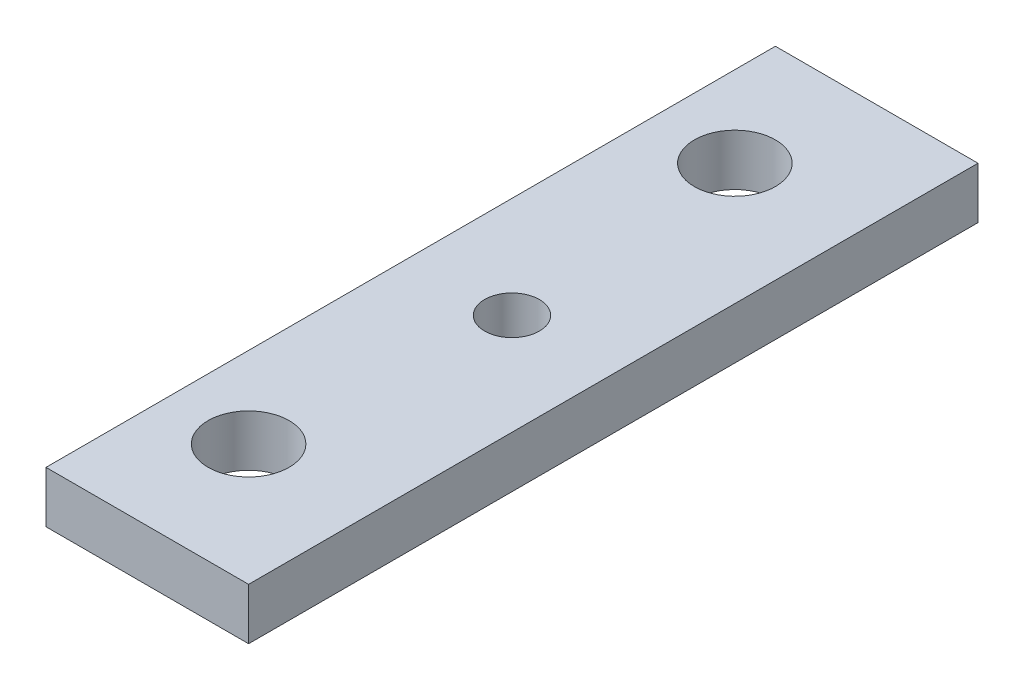
ISO-10303-21;
HEADER;
FILE_DESCRIPTION(('STEP AP214'),'2;1');
FILE_NAME('part.step','',(''),(''),'','','');
FILE_SCHEMA(('AUTOMOTIVE_DESIGN { 1 0 10303 214 1 1 1 1 }'));
ENDSEC;
DATA;
#1=APPLICATION_CONTEXT('core data for automotive mechanical design processes');
#2=APPLICATION_PROTOCOL_DEFINITION('international standard','automotive_design',2000,#1);
#3=PRODUCT_CONTEXT('',#1,'mechanical');
#4=PRODUCT('Part','Part','',(#3));
#5=PRODUCT_RELATED_PRODUCT_CATEGORY('part','',(#4));
#6=PRODUCT_DEFINITION_FORMATION('','',#4);
#7=PRODUCT_DEFINITION_CONTEXT('part definition',#1,'design');
#8=PRODUCT_DEFINITION('design','',#6,#7);
#9=PRODUCT_DEFINITION_SHAPE('','',#8);
#10=(LENGTH_UNIT() NAMED_UNIT(*) SI_UNIT(.MILLI.,.METRE.));
#11=(NAMED_UNIT(*) PLANE_ANGLE_UNIT() SI_UNIT($,.RADIAN.));
#12=(NAMED_UNIT(*) SI_UNIT($,.STERADIAN.) SOLID_ANGLE_UNIT());
#13=UNCERTAINTY_MEASURE_WITH_UNIT(LENGTH_MEASURE(1.E-05),#10,'distance_accuracy_value','');
#14=(GEOMETRIC_REPRESENTATION_CONTEXT(3) GLOBAL_UNCERTAINTY_ASSIGNED_CONTEXT((#13)) GLOBAL_UNIT_ASSIGNED_CONTEXT((#10,
#11,#12)) REPRESENTATION_CONTEXT('',''));
#15=CARTESIAN_POINT('',(0.,0.,0.));
#16=DIRECTION('',(0.,0.,1.));
#17=DIRECTION('',(1.,0.,0.));
#18=AXIS2_PLACEMENT_3D('',#15,#16,#17);
#19=CARTESIAN_POINT('',(0.,12.7,0.));
#20=DIRECTION('',(0.,-1.,0.));
#21=DIRECTION('',(0.,0.,-1.));
#22=AXIS2_PLACEMENT_3D('',#19,#20,#21);
#23=PLANE('',#22);
#24=DIRECTION('',(0.,0.,-1.));
#25=VECTOR('',#24,1.);
#26=CARTESIAN_POINT('',(25.,12.7,90.));
#27=LINE('',#26,#25);
#28=CARTESIAN_POINT('',(25.,12.7,90.));
#29=VERTEX_POINT('',#28);
#30=CARTESIAN_POINT('',(25.,12.7,-90.));
#31=VERTEX_POINT('',#30);
#32=EDGE_CURVE('E85',#29,#31,#27,.T.);
#33=ORIENTED_EDGE('',*,*,#32,.T.);
#34=DIRECTION('',(-1.,0.,0.));
#35=VECTOR('',#34,1.);
#36=CARTESIAN_POINT('',(-25.,12.7,-90.));
#37=LINE('',#36,#35);
#38=CARTESIAN_POINT('',(-25.,12.7,-90.));
#39=VERTEX_POINT('',#38);
#40=EDGE_CURVE('E80',#31,#39,#37,.T.);
#41=ORIENTED_EDGE('',*,*,#40,.T.);
#42=DIRECTION('',(0.,0.,1.));
#43=VECTOR('',#42,1.);
#44=CARTESIAN_POINT('',(-25.,12.7,90.));
#45=LINE('',#44,#43);
#46=CARTESIAN_POINT('',(-25.,12.7,90.));
#47=VERTEX_POINT('',#46);
#48=EDGE_CURVE('E83',#39,#47,#45,.T.);
#49=ORIENTED_EDGE('',*,*,#48,.T.);
#50=DIRECTION('',(1.,0.,0.));
#51=VECTOR('',#50,1.);
#52=CARTESIAN_POINT('',(-25.,12.7,90.));
#53=LINE('',#52,#51);
#54=EDGE_CURVE('E50',#47,#29,#53,.T.);
#55=ORIENTED_EDGE('',*,*,#54,.T.);
#56=EDGE_LOOP('',(#33,#41,#49,#55));
#57=FACE_BOUND('',#56,.T.);
#58=CARTESIAN_POINT('',(-5.,12.7,-60.));
#59=DIRECTION('',(0.,1.,0.));
#60=DIRECTION('',(0.,0.,1.));
#61=AXIS2_PLACEMENT_3D('',#58,#59,#60);
#62=CIRCLE('',#61,10.);
#63=CARTESIAN_POINT('',(-5.,12.7,-50.));
#64=VERTEX_POINT('',#63);
#65=EDGE_CURVE('E100',#64,#64,#62,.T.);
#66=ORIENTED_EDGE('',*,*,#65,.F.);
#67=EDGE_LOOP('',(#66));
#68=FACE_BOUND('',#67,.T.);
#69=CARTESIAN_POINT('',(-4.99999999999998,12.7,60.));
#70=DIRECTION('',(0.,1.,0.));
#71=DIRECTION('',(0.,0.,1.));
#72=AXIS2_PLACEMENT_3D('',#69,#70,#71);
#73=CIRCLE('',#72,10.);
#74=CARTESIAN_POINT('',(-4.99999999999998,12.7,70.));
#75=VERTEX_POINT('',#74);
#76=EDGE_CURVE('E115',#75,#75,#73,.T.);
#77=ORIENTED_EDGE('',*,*,#76,.F.);
#78=EDGE_LOOP('',(#77));
#79=FACE_BOUND('',#78,.T.);
#80=CARTESIAN_POINT('',(0.,12.7,0.));
#81=DIRECTION('',(0.,1.,0.));
#82=DIRECTION('',(0.,0.,1.));
#83=AXIS2_PLACEMENT_3D('',#80,#81,#82);
#84=CIRCLE('',#83,6.75968750309074);
#85=CARTESIAN_POINT('',(0.,12.7,6.75968750309075));
#86=VERTEX_POINT('',#85);
#87=EDGE_CURVE('E121',#86,#86,#84,.T.);
#88=ORIENTED_EDGE('',*,*,#87,.F.);
#89=EDGE_LOOP('',(#88));
#90=FACE_BOUND('',#89,.T.);
#91=ADVANCED_FACE('F33',(#57,#68,#79,#90),#23,.F.);
#92=CARTESIAN_POINT('',(0.,0.,0.));
#93=DIRECTION('',(0.,-1.,0.));
#94=DIRECTION('',(0.,0.,-1.));
#95=AXIS2_PLACEMENT_3D('',#92,#93,#94);
#96=PLANE('',#95);
#97=CARTESIAN_POINT('',(-4.99999999999998,0.,60.));
#98=DIRECTION('',(0.,1.,0.));
#99=DIRECTION('',(0.,0.,1.));
#100=AXIS2_PLACEMENT_3D('',#97,#98,#99);
#101=CIRCLE('',#100,10.);
#102=CARTESIAN_POINT('',(-4.99999999999998,0.,70.));
#103=VERTEX_POINT('',#102);
#104=EDGE_CURVE('E118',#103,#103,#101,.T.);
#105=ORIENTED_EDGE('',*,*,#104,.T.);
#106=EDGE_LOOP('',(#105));
#107=FACE_BOUND('',#106,.T.);
#108=DIRECTION('',(0.,0.,-1.));
#109=VECTOR('',#108,1.);
#110=CARTESIAN_POINT('',(25.,0.,90.));
#111=LINE('',#110,#109);
#112=CARTESIAN_POINT('',(25.,0.,90.));
#113=VERTEX_POINT('',#112);
#114=CARTESIAN_POINT('',(25.,0.,-90.));
#115=VERTEX_POINT('',#114);
#116=EDGE_CURVE('E97',#113,#115,#111,.T.);
#117=ORIENTED_EDGE('',*,*,#116,.F.);
#118=DIRECTION('',(1.,0.,0.));
#119=VECTOR('',#118,1.);
#120=CARTESIAN_POINT('',(-25.,0.,90.));
#121=LINE('',#120,#119);
#122=CARTESIAN_POINT('',(-25.,0.,90.));
#123=VERTEX_POINT('',#122);
#124=EDGE_CURVE('E73',#123,#113,#121,.T.);
#125=ORIENTED_EDGE('',*,*,#124,.F.);
#126=DIRECTION('',(0.,0.,1.));
#127=VECTOR('',#126,1.);
#128=CARTESIAN_POINT('',(-25.,0.,90.));
#129=LINE('',#128,#127);
#130=CARTESIAN_POINT('',(-25.,0.,-90.));
#131=VERTEX_POINT('',#130);
#132=EDGE_CURVE('E67',#131,#123,#129,.T.);
#133=ORIENTED_EDGE('',*,*,#132,.F.);
#134=DIRECTION('',(-1.,0.,0.));
#135=VECTOR('',#134,1.);
#136=CARTESIAN_POINT('',(-25.,0.,-90.));
#137=LINE('',#136,#135);
#138=EDGE_CURVE('E89',#115,#131,#137,.T.);
#139=ORIENTED_EDGE('',*,*,#138,.F.);
#140=EDGE_LOOP('',(#117,#125,#133,#139));
#141=FACE_BOUND('',#140,.T.);
#142=CARTESIAN_POINT('',(-5.,0.,-60.));
#143=DIRECTION('',(0.,1.,0.));
#144=DIRECTION('',(0.,0.,1.));
#145=AXIS2_PLACEMENT_3D('',#142,#143,#144);
#146=CIRCLE('',#145,10.);
#147=CARTESIAN_POINT('',(-5.,0.,-50.));
#148=VERTEX_POINT('',#147);
#149=EDGE_CURVE('E112',#148,#148,#146,.T.);
#150=ORIENTED_EDGE('',*,*,#149,.T.);
#151=EDGE_LOOP('',(#150));
#152=FACE_BOUND('',#151,.T.);
#153=CARTESIAN_POINT('',(0.,0.,0.));
#154=DIRECTION('',(0.,1.,0.));
#155=DIRECTION('',(0.,0.,1.));
#156=AXIS2_PLACEMENT_3D('',#153,#154,#155);
#157=CIRCLE('',#156,6.75968750309074);
#158=CARTESIAN_POINT('',(0.,0.,6.75968750309075));
#159=VERTEX_POINT('',#158);
#160=EDGE_CURVE('E124',#159,#159,#157,.T.);
#161=ORIENTED_EDGE('',*,*,#160,.T.);
#162=EDGE_LOOP('',(#161));
#163=FACE_BOUND('',#162,.T.);
#164=ADVANCED_FACE('F108',(#107,#141,#152,#163),#96,.T.);
#165=CARTESIAN_POINT('',(25.,12.7,90.));
#166=DIRECTION('',(-1.,0.,0.));
#167=DIRECTION('',(0.,0.,1.));
#168=AXIS2_PLACEMENT_3D('',#165,#166,#167);
#169=PLANE('',#168);
#170=ORIENTED_EDGE('',*,*,#116,.T.);
#171=DIRECTION('',(0.,-1.,0.));
#172=VECTOR('',#171,1.);
#173=CARTESIAN_POINT('',(25.,12.7,-90.));
#174=LINE('',#173,#172);
#175=EDGE_CURVE('E11',#31,#115,#174,.T.);
#176=ORIENTED_EDGE('',*,*,#175,.F.);
#177=ORIENTED_EDGE('',*,*,#32,.F.);
#178=DIRECTION('',(0.,-1.,0.));
#179=VECTOR('',#178,1.);
#180=CARTESIAN_POINT('',(25.,12.7,90.));
#181=LINE('',#180,#179);
#182=EDGE_CURVE('E93',#29,#113,#181,.T.);
#183=ORIENTED_EDGE('',*,*,#182,.T.);
#184=EDGE_LOOP('',(#170,#176,#177,#183));
#185=FACE_BOUND('',#184,.T.);
#186=ADVANCED_FACE('F35',(#185),#169,.F.);
#187=CARTESIAN_POINT('',(-25.,12.7,-90.));
#188=DIRECTION('',(0.,0.,1.));
#189=DIRECTION('',(1.,0.,0.));
#190=AXIS2_PLACEMENT_3D('',#187,#188,#189);
#191=PLANE('',#190);
#192=ORIENTED_EDGE('',*,*,#138,.T.);
#193=DIRECTION('',(0.,-1.,0.));
#194=VECTOR('',#193,1.);
#195=CARTESIAN_POINT('',(-25.,12.7,-90.));
#196=LINE('',#195,#194);
#197=EDGE_CURVE('E42',#39,#131,#196,.T.);
#198=ORIENTED_EDGE('',*,*,#197,.F.);
#199=ORIENTED_EDGE('',*,*,#40,.F.);
#200=ORIENTED_EDGE('',*,*,#175,.T.);
#201=EDGE_LOOP('',(#192,#198,#199,#200));
#202=FACE_BOUND('',#201,.T.);
#203=ADVANCED_FACE('F88',(#202),#191,.F.);
#204=CARTESIAN_POINT('',(-25.,12.7,90.));
#205=DIRECTION('',(1.,0.,0.));
#206=DIRECTION('',(0.,0.,-1.));
#207=AXIS2_PLACEMENT_3D('',#204,#205,#206);
#208=PLANE('',#207);
#209=ORIENTED_EDGE('',*,*,#132,.T.);
#210=DIRECTION('',(0.,-1.,0.));
#211=VECTOR('',#210,1.);
#212=CARTESIAN_POINT('',(-25.,12.7,90.));
#213=LINE('',#212,#211);
#214=EDGE_CURVE('E90',#47,#123,#213,.T.);
#215=ORIENTED_EDGE('',*,*,#214,.F.);
#216=ORIENTED_EDGE('',*,*,#48,.F.);
#217=ORIENTED_EDGE('',*,*,#197,.T.);
#218=EDGE_LOOP('',(#209,#215,#216,#217));
#219=FACE_BOUND('',#218,.T.);
#220=ADVANCED_FACE('F91',(#219),#208,.F.);
#221=CARTESIAN_POINT('',(-25.,12.7,90.));
#222=DIRECTION('',(0.,0.,-1.));
#223=DIRECTION('',(-1.,0.,0.));
#224=AXIS2_PLACEMENT_3D('',#221,#222,#223);
#225=PLANE('',#224);
#226=ORIENTED_EDGE('',*,*,#124,.T.);
#227=ORIENTED_EDGE('',*,*,#182,.F.);
#228=ORIENTED_EDGE('',*,*,#54,.F.);
#229=ORIENTED_EDGE('',*,*,#214,.T.);
#230=EDGE_LOOP('',(#226,#227,#228,#229));
#231=FACE_BOUND('',#230,.T.);
#232=ADVANCED_FACE('F105',(#231),#225,.F.);
#233=CARTESIAN_POINT('',(-5.,12.7,-60.));
#234=DIRECTION('',(0.,-1.,0.));
#235=DIRECTION('',(0.,0.,-1.));
#236=AXIS2_PLACEMENT_3D('',#233,#234,#235);
#237=CYLINDRICAL_SURFACE('',#236,10.);
#238=ORIENTED_EDGE('',*,*,#65,.T.);
#239=EDGE_LOOP('',(#238));
#240=FACE_BOUND('',#239,.T.);
#241=ORIENTED_EDGE('',*,*,#149,.F.);
#242=EDGE_LOOP('',(#241));
#243=FACE_BOUND('',#242,.T.);
#244=ADVANCED_FACE('F141',(#240,#243),#237,.F.);
#245=CARTESIAN_POINT('',(-4.99999999999998,12.7,60.));
#246=DIRECTION('',(0.,-1.,0.));
#247=DIRECTION('',(0.,0.,-1.));
#248=AXIS2_PLACEMENT_3D('',#245,#246,#247);
#249=CYLINDRICAL_SURFACE('',#248,10.);
#250=ORIENTED_EDGE('',*,*,#76,.T.);
#251=EDGE_LOOP('',(#250));
#252=FACE_BOUND('',#251,.T.);
#253=ORIENTED_EDGE('',*,*,#104,.F.);
#254=EDGE_LOOP('',(#253));
#255=FACE_BOUND('',#254,.T.);
#256=ADVANCED_FACE('F187',(#252,#255),#249,.F.);
#257=CARTESIAN_POINT('',(0.,12.7,0.));
#258=DIRECTION('',(0.,-1.,0.));
#259=DIRECTION('',(0.,0.,-1.));
#260=AXIS2_PLACEMENT_3D('',#257,#258,#259);
#261=CYLINDRICAL_SURFACE('',#260,6.75968750309074);
#262=ORIENTED_EDGE('',*,*,#87,.T.);
#263=EDGE_LOOP('',(#262));
#264=FACE_BOUND('',#263,.T.);
#265=ORIENTED_EDGE('',*,*,#160,.F.);
#266=EDGE_LOOP('',(#265));
#267=FACE_BOUND('',#266,.T.);
#268=ADVANCED_FACE('F130',(#264,#267),#261,.F.);
#269=CLOSED_SHELL('',(#91,#164,#186,#203,#220,#232,#244,#256,#268));
#270=MANIFOLD_SOLID_BREP('B2',#269);
#271=ADVANCED_BREP_SHAPE_REPRESENTATION('',(#18,#270),#14);
#272=SHAPE_DEFINITION_REPRESENTATION(#9,#271);
ENDSEC;
END-ISO-10303-21;
